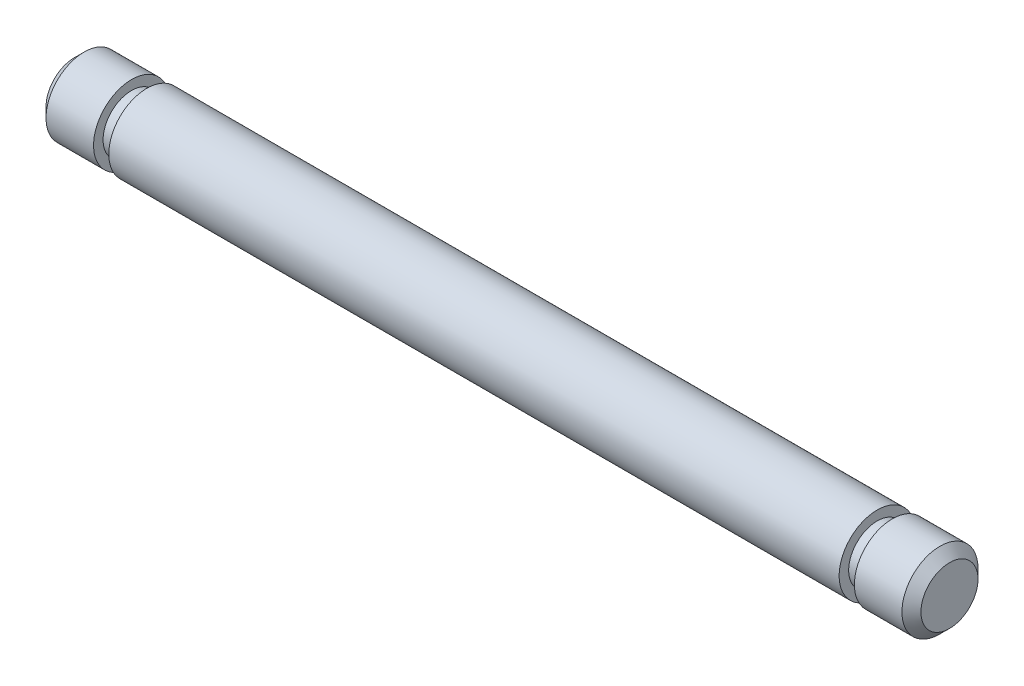
ISO-10303-21;
HEADER;
FILE_DESCRIPTION(('STEP AP214'),'2;1');
FILE_NAME('part.step','',(''),(''),'','','');
FILE_SCHEMA(('AUTOMOTIVE_DESIGN { 1 0 10303 214 1 1 1 1 }'));
ENDSEC;
DATA;
#1=APPLICATION_CONTEXT('core data for automotive mechanical design processes');
#2=APPLICATION_PROTOCOL_DEFINITION('international standard','automotive_design',2000,#1);
#3=PRODUCT_CONTEXT('',#1,'mechanical');
#4=PRODUCT('Part','Part','',(#3));
#5=PRODUCT_RELATED_PRODUCT_CATEGORY('part','',(#4));
#6=PRODUCT_DEFINITION_FORMATION('','',#4);
#7=PRODUCT_DEFINITION_CONTEXT('part definition',#1,'design');
#8=PRODUCT_DEFINITION('design','',#6,#7);
#9=PRODUCT_DEFINITION_SHAPE('','',#8);
#10=(LENGTH_UNIT() NAMED_UNIT(*) SI_UNIT(.MILLI.,.METRE.));
#11=(NAMED_UNIT(*) PLANE_ANGLE_UNIT() SI_UNIT($,.RADIAN.));
#12=(NAMED_UNIT(*) SI_UNIT($,.STERADIAN.) SOLID_ANGLE_UNIT());
#13=UNCERTAINTY_MEASURE_WITH_UNIT(LENGTH_MEASURE(1.E-05),#10,'distance_accuracy_value','');
#14=(GEOMETRIC_REPRESENTATION_CONTEXT(3) GLOBAL_UNCERTAINTY_ASSIGNED_CONTEXT((#13)) GLOBAL_UNIT_ASSIGNED_CONTEXT((#10,
#11,#12)) REPRESENTATION_CONTEXT('',''));
#15=CARTESIAN_POINT('',(0.,0.,0.));
#16=DIRECTION('',(0.,0.,1.));
#17=DIRECTION('',(1.,0.,0.));
#18=AXIS2_PLACEMENT_3D('',#15,#16,#17);
#19=CARTESIAN_POINT('',(23.,0.,0.));
#20=DIRECTION('',(-1.,0.,0.));
#21=DIRECTION('',(0.,0.,1.));
#22=AXIS2_PLACEMENT_3D('',#19,#20,#21);
#23=CYLINDRICAL_SURFACE('',#22,2.);
#24=CARTESIAN_POINT('',(19.2,0.,0.));
#25=DIRECTION('',(1.,0.,0.));
#26=DIRECTION('',(0.,0.,-1.));
#27=AXIS2_PLACEMENT_3D('',#24,#25,#26);
#28=CIRCLE('',#27,2.);
#29=CARTESIAN_POINT('',(19.2,0.,-2.));
#30=VERTEX_POINT('',#29);
#31=EDGE_CURVE('E51',#30,#30,#28,.T.);
#32=ORIENTED_EDGE('',*,*,#31,.F.);
#33=EDGE_LOOP('',(#32));
#34=FACE_BOUND('',#33,.T.);
#35=CARTESIAN_POINT('',(-19.2,0.,0.));
#36=DIRECTION('',(1.,0.,0.));
#37=DIRECTION('',(0.,0.,-1.));
#38=AXIS2_PLACEMENT_3D('',#35,#36,#37);
#39=CIRCLE('',#38,2.);
#40=CARTESIAN_POINT('',(-19.2,0.,-2.));
#41=VERTEX_POINT('',#40);
#42=EDGE_CURVE('E61',#41,#41,#39,.T.);
#43=ORIENTED_EDGE('',*,*,#42,.T.);
#44=EDGE_LOOP('',(#43));
#45=FACE_BOUND('',#44,.T.);
#46=ADVANCED_FACE('F31',(#34,#45),#23,.T.);
#47=CARTESIAN_POINT('',(19.2,0.,0.));
#48=DIRECTION('',(1.,0.,0.));
#49=DIRECTION('',(0.,0.,-1.));
#50=AXIS2_PLACEMENT_3D('',#47,#48,#49);
#51=PLANE('',#50);
#52=CARTESIAN_POINT('',(19.2,0.,0.));
#53=DIRECTION('',(1.,0.,0.));
#54=DIRECTION('',(0.,0.,-1.));
#55=AXIS2_PLACEMENT_3D('',#52,#53,#54);
#56=CIRCLE('',#55,1.5);
#57=CARTESIAN_POINT('',(19.2,0.,-1.5));
#58=VERTEX_POINT('',#57);
#59=EDGE_CURVE('E55',#58,#58,#56,.T.);
#60=ORIENTED_EDGE('',*,*,#59,.F.);
#61=EDGE_LOOP('',(#60));
#62=FACE_BOUND('',#61,.T.);
#63=ORIENTED_EDGE('',*,*,#31,.T.);
#64=EDGE_LOOP('',(#63));
#65=FACE_BOUND('',#64,.T.);
#66=ADVANCED_FACE('F97',(#62,#65),#51,.T.);
#67=CARTESIAN_POINT('',(20.,0.,0.));
#68=DIRECTION('',(1.,0.,0.));
#69=DIRECTION('',(0.,0.,-1.));
#70=AXIS2_PLACEMENT_3D('',#67,#68,#69);
#71=PLANE('',#70);
#72=CARTESIAN_POINT('',(20.,0.,0.));
#73=DIRECTION('',(1.,0.,0.));
#74=DIRECTION('',(0.,0.,-1.));
#75=AXIS2_PLACEMENT_3D('',#72,#73,#74);
#76=CIRCLE('',#75,1.5);
#77=CARTESIAN_POINT('',(20.,0.,-1.5));
#78=VERTEX_POINT('',#77);
#79=EDGE_CURVE('E58',#78,#78,#76,.T.);
#80=ORIENTED_EDGE('',*,*,#79,.T.);
#81=EDGE_LOOP('',(#80));
#82=FACE_BOUND('',#81,.T.);
#83=CARTESIAN_POINT('',(20.,0.,0.));
#84=DIRECTION('',(1.,0.,0.));
#85=DIRECTION('',(0.,0.,-1.));
#86=AXIS2_PLACEMENT_3D('',#83,#84,#85);
#87=CIRCLE('',#86,2.);
#88=CARTESIAN_POINT('',(20.,0.,-2.));
#89=VERTEX_POINT('',#88);
#90=EDGE_CURVE('E52',#89,#89,#87,.T.);
#91=ORIENTED_EDGE('',*,*,#90,.F.);
#92=EDGE_LOOP('',(#91));
#93=FACE_BOUND('',#92,.T.);
#94=ADVANCED_FACE('F104',(#82,#93),#71,.F.);
#95=CARTESIAN_POINT('',(19.2,0.,0.));
#96=DIRECTION('',(1.,0.,0.));
#97=DIRECTION('',(0.,0.,-1.));
#98=AXIS2_PLACEMENT_3D('',#95,#96,#97);
#99=CYLINDRICAL_SURFACE('',#98,1.5);
#100=ORIENTED_EDGE('',*,*,#59,.T.);
#101=EDGE_LOOP('',(#100));
#102=FACE_BOUND('',#101,.T.);
#103=ORIENTED_EDGE('',*,*,#79,.F.);
#104=EDGE_LOOP('',(#103));
#105=FACE_BOUND('',#104,.T.);
#106=ADVANCED_FACE('F126',(#102,#105),#99,.T.);
#107=CARTESIAN_POINT('',(23.,0.,0.));
#108=DIRECTION('',(1.,0.,0.));
#109=DIRECTION('',(0.,0.,-1.));
#110=AXIS2_PLACEMENT_3D('',#107,#108,#109);
#111=PLANE('',#110);
#112=CARTESIAN_POINT('',(23.,0.,0.));
#113=DIRECTION('',(1.,0.,0.));
#114=DIRECTION('',(0.,0.,-1.));
#115=AXIS2_PLACEMENT_3D('',#112,#113,#114);
#116=CIRCLE('',#115,1.49999999999999);
#117=CARTESIAN_POINT('',(23.,0.,-1.49999999999999));
#118=VERTEX_POINT('',#117);
#119=EDGE_CURVE('E10',#118,#118,#116,.T.);
#120=ORIENTED_EDGE('',*,*,#119,.T.);
#121=EDGE_LOOP('',(#120));
#122=FACE_BOUND('',#121,.T.);
#123=ADVANCED_FACE('F118',(#122),#111,.T.);
#124=CARTESIAN_POINT('',(23.,0.,0.));
#125=DIRECTION('',(-1.,0.,0.));
#126=DIRECTION('',(0.,0.,1.));
#127=AXIS2_PLACEMENT_3D('',#124,#125,#126);
#128=CONICAL_SURFACE('',#127,1.49999999999999,0.785398163397453);
#129=CARTESIAN_POINT('',(22.5,0.,0.));
#130=DIRECTION('',(1.,0.,0.));
#131=DIRECTION('',(0.,0.,-1.));
#132=AXIS2_PLACEMENT_3D('',#129,#130,#131);
#133=CIRCLE('',#132,2.);
#134=CARTESIAN_POINT('',(22.5,0.,-2.));
#135=VERTEX_POINT('',#134);
#136=EDGE_CURVE('E46',#135,#135,#133,.F.);
#137=ORIENTED_EDGE('',*,*,#136,.F.);
#138=EDGE_LOOP('',(#137));
#139=FACE_BOUND('',#138,.T.);
#140=ORIENTED_EDGE('',*,*,#119,.F.);
#141=EDGE_LOOP('',(#140));
#142=FACE_BOUND('',#141,.T.);
#143=ADVANCED_FACE('F33',(#139,#142),#128,.T.);
#144=ORIENTED_EDGE('',*,*,#90,.T.);
#145=EDGE_LOOP('',(#144));
#146=FACE_BOUND('',#145,.T.);
#147=ORIENTED_EDGE('',*,*,#136,.T.);
#148=EDGE_LOOP('',(#147));
#149=FACE_BOUND('',#148,.T.);
#150=ADVANCED_FACE('F92',(#146,#149),#23,.T.);
#151=CARTESIAN_POINT('',(-19.2,0.,0.));
#152=DIRECTION('',(-1.,0.,0.));
#153=DIRECTION('',(0.,0.,-1.));
#154=AXIS2_PLACEMENT_3D('',#151,#152,#153);
#155=PLANE('',#154);
#156=ORIENTED_EDGE('',*,*,#42,.F.);
#157=EDGE_LOOP('',(#156));
#158=FACE_BOUND('',#157,.T.);
#159=CARTESIAN_POINT('',(-19.2,0.,0.));
#160=DIRECTION('',(1.,0.,0.));
#161=DIRECTION('',(0.,0.,-1.));
#162=AXIS2_PLACEMENT_3D('',#159,#160,#161);
#163=CIRCLE('',#162,1.5);
#164=CARTESIAN_POINT('',(-19.2,0.,-1.5));
#165=VERTEX_POINT('',#164);
#166=EDGE_CURVE('E67',#165,#165,#163,.T.);
#167=ORIENTED_EDGE('',*,*,#166,.T.);
#168=EDGE_LOOP('',(#167));
#169=FACE_BOUND('',#168,.T.);
#170=ADVANCED_FACE('F76',(#158,#169),#155,.T.);
#171=CARTESIAN_POINT('',(-20.,0.,0.));
#172=DIRECTION('',(-1.,0.,0.));
#173=DIRECTION('',(0.,0.,-1.));
#174=AXIS2_PLACEMENT_3D('',#171,#172,#173);
#175=PLANE('',#174);
#176=CARTESIAN_POINT('',(-20.,0.,0.));
#177=DIRECTION('',(1.,0.,0.));
#178=DIRECTION('',(0.,0.,-1.));
#179=AXIS2_PLACEMENT_3D('',#176,#177,#178);
#180=CIRCLE('',#179,2.);
#181=CARTESIAN_POINT('',(-20.,0.,-2.));
#182=VERTEX_POINT('',#181);
#183=EDGE_CURVE('E64',#182,#182,#180,.T.);
#184=ORIENTED_EDGE('',*,*,#183,.T.);
#185=EDGE_LOOP('',(#184));
#186=FACE_BOUND('',#185,.T.);
#187=CARTESIAN_POINT('',(-20.,0.,0.));
#188=DIRECTION('',(1.,0.,0.));
#189=DIRECTION('',(0.,0.,-1.));
#190=AXIS2_PLACEMENT_3D('',#187,#188,#189);
#191=CIRCLE('',#190,1.5);
#192=CARTESIAN_POINT('',(-20.,0.,-1.5));
#193=VERTEX_POINT('',#192);
#194=EDGE_CURVE('E70',#193,#193,#191,.T.);
#195=ORIENTED_EDGE('',*,*,#194,.F.);
#196=EDGE_LOOP('',(#195));
#197=FACE_BOUND('',#196,.T.);
#198=ADVANCED_FACE('F82',(#186,#197),#175,.F.);
#199=CARTESIAN_POINT('',(-19.2,0.,0.));
#200=DIRECTION('',(-1.,0.,0.));
#201=DIRECTION('',(0.,0.,1.));
#202=AXIS2_PLACEMENT_3D('',#199,#200,#201);
#203=CYLINDRICAL_SURFACE('',#202,1.5);
#204=ORIENTED_EDGE('',*,*,#166,.F.);
#205=EDGE_LOOP('',(#204));
#206=FACE_BOUND('',#205,.T.);
#207=ORIENTED_EDGE('',*,*,#194,.T.);
#208=EDGE_LOOP('',(#207));
#209=FACE_BOUND('',#208,.T.);
#210=ADVANCED_FACE('F78',(#206,#209),#203,.T.);
#211=CARTESIAN_POINT('',(-23.,0.,0.));
#212=DIRECTION('',(1.,0.,0.));
#213=DIRECTION('',(0.,0.,-1.));
#214=AXIS2_PLACEMENT_3D('',#211,#212,#213);
#215=PLANE('',#214);
#216=CARTESIAN_POINT('',(-23.,0.,0.));
#217=DIRECTION('',(1.,0.,0.));
#218=DIRECTION('',(0.,0.,-1.));
#219=AXIS2_PLACEMENT_3D('',#216,#217,#218);
#220=CIRCLE('',#219,1.5);
#221=CARTESIAN_POINT('',(-23.,0.,-1.5));
#222=VERTEX_POINT('',#221);
#223=EDGE_CURVE('E38',#222,#222,#220,.F.);
#224=ORIENTED_EDGE('',*,*,#223,.T.);
#225=EDGE_LOOP('',(#224));
#226=FACE_BOUND('',#225,.T.);
#227=ADVANCED_FACE('F81',(#226),#215,.F.);
#228=CARTESIAN_POINT('',(-22.5,0.,0.));
#229=DIRECTION('',(1.,0.,0.));
#230=DIRECTION('',(0.,0.,-1.));
#231=AXIS2_PLACEMENT_3D('',#228,#229,#230);
#232=CONICAL_SURFACE('',#231,2.,0.785398163397453);
#233=ORIENTED_EDGE('',*,*,#223,.F.);
#234=EDGE_LOOP('',(#233));
#235=FACE_BOUND('',#234,.T.);
#236=CARTESIAN_POINT('',(-22.5,0.,0.));
#237=DIRECTION('',(1.,0.,0.));
#238=DIRECTION('',(0.,0.,-1.));
#239=AXIS2_PLACEMENT_3D('',#236,#237,#238);
#240=CIRCLE('',#239,2.);
#241=CARTESIAN_POINT('',(-22.5,0.,-2.));
#242=VERTEX_POINT('',#241);
#243=EDGE_CURVE('E42',#242,#242,#240,.T.);
#244=ORIENTED_EDGE('',*,*,#243,.F.);
#245=EDGE_LOOP('',(#244));
#246=FACE_BOUND('',#245,.T.);
#247=ADVANCED_FACE('F111',(#235,#246),#232,.T.);
#248=ORIENTED_EDGE('',*,*,#183,.F.);
#249=EDGE_LOOP('',(#248));
#250=FACE_BOUND('',#249,.T.);
#251=ORIENTED_EDGE('',*,*,#243,.T.);
#252=EDGE_LOOP('',(#251));
#253=FACE_BOUND('',#252,.T.);
#254=ADVANCED_FACE('F100',(#250,#253),#23,.T.);
#255=CLOSED_SHELL('',(#46,#66,#94,#106,#123,#143,#150,#170,#198,#210,#227,#247,#254));
#256=MANIFOLD_SOLID_BREP('B2',#255);
#257=ADVANCED_BREP_SHAPE_REPRESENTATION('',(#18,#256),#14);
#258=SHAPE_DEFINITION_REPRESENTATION(#9,#257);
ENDSEC;
END-ISO-10303-21;
